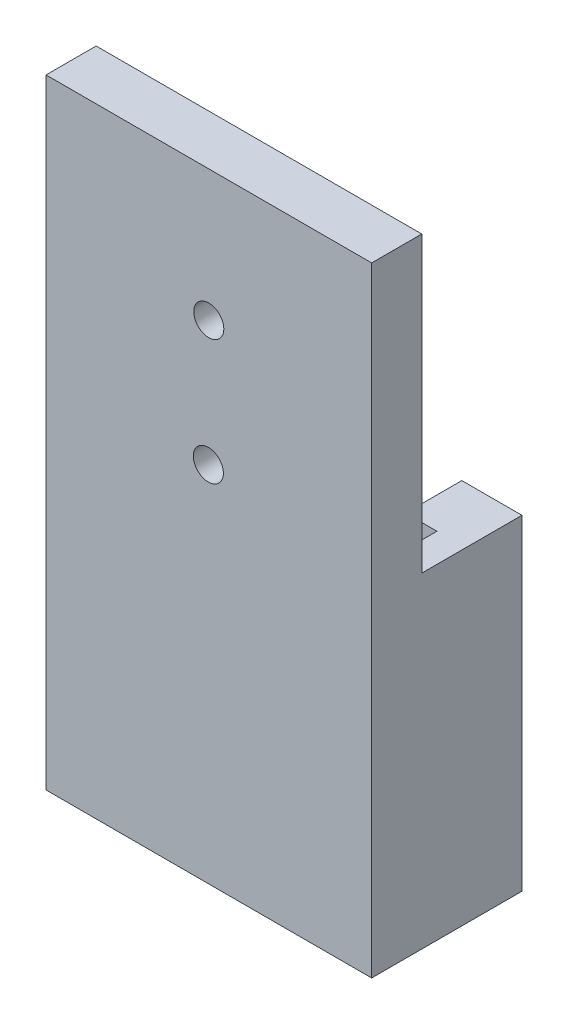
ISO-10303-21;
HEADER;
FILE_DESCRIPTION(('STEP AP214'),'2;1');
FILE_NAME('part.step','',(''),(''),'','','');
FILE_SCHEMA(('AUTOMOTIVE_DESIGN { 1 0 10303 214 1 1 1 1 }'));
ENDSEC;
DATA;
#1=APPLICATION_CONTEXT('core data for automotive mechanical design processes');
#2=APPLICATION_PROTOCOL_DEFINITION('international standard','automotive_design',2000,#1);
#3=PRODUCT_CONTEXT('',#1,'mechanical');
#4=PRODUCT('Part','Part','',(#3));
#5=PRODUCT_RELATED_PRODUCT_CATEGORY('part','',(#4));
#6=PRODUCT_DEFINITION_FORMATION('','',#4);
#7=PRODUCT_DEFINITION_CONTEXT('part definition',#1,'design');
#8=PRODUCT_DEFINITION('design','',#6,#7);
#9=PRODUCT_DEFINITION_SHAPE('','',#8);
#10=(LENGTH_UNIT() NAMED_UNIT(*) SI_UNIT(.MILLI.,.METRE.));
#11=(NAMED_UNIT(*) PLANE_ANGLE_UNIT() SI_UNIT($,.RADIAN.));
#12=(NAMED_UNIT(*) SI_UNIT($,.STERADIAN.) SOLID_ANGLE_UNIT());
#13=UNCERTAINTY_MEASURE_WITH_UNIT(LENGTH_MEASURE(1.E-05),#10,'distance_accuracy_value','');
#14=(GEOMETRIC_REPRESENTATION_CONTEXT(3) GLOBAL_UNCERTAINTY_ASSIGNED_CONTEXT((#13)) GLOBAL_UNIT_ASSIGNED_CONTEXT((#10,
#11,#12)) REPRESENTATION_CONTEXT('',''));
#15=CARTESIAN_POINT('',(0.,0.,0.));
#16=DIRECTION('',(0.,0.,1.));
#17=DIRECTION('',(1.,0.,0.));
#18=AXIS2_PLACEMENT_3D('',#15,#16,#17);
#19=CARTESIAN_POINT('',(0.,16.,0.));
#20=DIRECTION('',(0.,1.,0.));
#21=DIRECTION('',(-1.,0.,0.));
#22=AXIS2_PLACEMENT_3D('',#19,#20,#21);
#23=PLANE('',#22);
#24=DIRECTION('',(0.,0.,-1.));
#25=VECTOR('',#24,1.);
#26=CARTESIAN_POINT('',(-5.14366425361586,16.,4.));
#27=LINE('',#26,#25);
#28=CARTESIAN_POINT('',(-5.14366425361586,16.,0.));
#29=VERTEX_POINT('',#28);
#30=CARTESIAN_POINT('',(-5.14366425361586,16.,-8.));
#31=VERTEX_POINT('',#30);
#32=EDGE_CURVE('E180',#29,#31,#27,.T.);
#33=ORIENTED_EDGE('',*,*,#32,.F.);
#34=DIRECTION('',(1.,0.,0.));
#35=VECTOR('',#34,1.);
#36=CARTESIAN_POINT('',(0.,16.,0.));
#37=LINE('',#36,#35);
#38=CARTESIAN_POINT('',(0.,16.,0.));
#39=VERTEX_POINT('',#38);
#40=EDGE_CURVE('E177',#29,#39,#37,.T.);
#41=ORIENTED_EDGE('',*,*,#40,.T.);
#42=DIRECTION('',(0.00140481763492439,0.,0.999999013243219));
#43=VECTOR('',#42,1.);
#44=CARTESIAN_POINT('',(-0.000702409510571505,16.,-0.500000000000003));
#45=LINE('',#44,#43);
#46=CARTESIAN_POINT('',(-0.000702409510571505,16.,-0.500000000000003));
#47=VERTEX_POINT('',#46);
#48=EDGE_CURVE('E204',#47,#39,#45,.T.);
#49=ORIENTED_EDGE('',*,*,#48,.F.);
#50=DIRECTION('',(1.,0.,0.));
#51=VECTOR('',#50,1.);
#52=CARTESIAN_POINT('',(-2.85496603758894,16.,-0.500000000000003));
#53=LINE('',#52,#51);
#54=CARTESIAN_POINT('',(-2.85496603758894,16.,-0.500000000000003));
#55=VERTEX_POINT('',#54);
#56=EDGE_CURVE('E201',#55,#47,#53,.T.);
#57=ORIENTED_EDGE('',*,*,#56,.F.);
#58=DIRECTION('',(0.,0.,1.));
#59=VECTOR('',#58,1.);
#60=CARTESIAN_POINT('',(-2.85496603758894,16.,-3.5));
#61=LINE('',#60,#59);
#62=CARTESIAN_POINT('',(-2.85496603758894,16.,-3.5));
#63=VERTEX_POINT('',#62);
#64=EDGE_CURVE('E198',#63,#55,#61,.T.);
#65=ORIENTED_EDGE('',*,*,#64,.F.);
#66=DIRECTION('',(-1.,0.,0.));
#67=VECTOR('',#66,1.);
#68=CARTESIAN_POINT('',(-0.343664253615856,16.,-3.5));
#69=LINE('',#68,#67);
#70=CARTESIAN_POINT('',(-0.343664253615856,16.,-3.5));
#71=VERTEX_POINT('',#70);
#72=EDGE_CURVE('E195',#71,#63,#69,.T.);
#73=ORIENTED_EDGE('',*,*,#72,.F.);
#74=DIRECTION('',(0.,0.,1.));
#75=VECTOR('',#74,1.);
#76=CARTESIAN_POINT('',(-0.343664253615856,16.,-3.5));
#77=LINE('',#76,#75);
#78=CARTESIAN_POINT('',(-0.343664253615856,16.,-8.));
#79=VERTEX_POINT('',#78);
#80=EDGE_CURVE('E192',#79,#71,#77,.T.);
#81=ORIENTED_EDGE('',*,*,#80,.F.);
#82=DIRECTION('',(1.,0.,0.));
#83=VECTOR('',#82,1.);
#84=CARTESIAN_POINT('',(-5.14366425361586,16.,-8.));
#85=LINE('',#84,#83);
#86=EDGE_CURVE('E183',#31,#79,#85,.T.);
#87=ORIENTED_EDGE('',*,*,#86,.F.);
#88=EDGE_LOOP('',(#33,#41,#49,#57,#65,#73,#81,#87));
#89=FACE_BOUND('',#88,.T.);
#90=ADVANCED_FACE('F33',(#89),#23,.T.);
#91=DIRECTION('',(0.0014048176349244,0.,-0.999999013243219));
#92=VECTOR('',#91,1.);
#93=CARTESIAN_POINT('',(15.7133739022788,16.,-0.500000000000001));
#94=LINE('',#93,#92);
#95=CARTESIAN_POINT('',(15.7126714927683,16.,0.));
#96=VERTEX_POINT('',#95);
#97=CARTESIAN_POINT('',(15.7133739022788,16.,-0.500000000000001));
#98=VERTEX_POINT('',#97);
#99=EDGE_CURVE('E176',#96,#98,#94,.T.);
#100=ORIENTED_EDGE('',*,*,#99,.F.);
#101=DIRECTION('',(1.,0.,0.));
#102=VECTOR('',#101,1.);
#103=CARTESIAN_POINT('',(14.3444247635274,16.,0.));
#104=LINE('',#103,#102);
#105=CARTESIAN_POINT('',(20.8563357463841,16.,0.));
#106=VERTEX_POINT('',#105);
#107=EDGE_CURVE('E163',#96,#106,#104,.T.);
#108=ORIENTED_EDGE('',*,*,#107,.T.);
#109=DIRECTION('',(0.,0.,1.));
#110=VECTOR('',#109,1.);
#111=CARTESIAN_POINT('',(20.8563357463841,16.,4.00000000000001));
#112=LINE('',#111,#110);
#113=CARTESIAN_POINT('',(20.8563357463841,16.,-8.));
#114=VERTEX_POINT('',#113);
#115=EDGE_CURVE('E172',#114,#106,#112,.T.);
#116=ORIENTED_EDGE('',*,*,#115,.F.);
#117=DIRECTION('',(1.,0.,0.));
#118=VECTOR('',#117,1.);
#119=CARTESIAN_POINT('',(20.8563357463841,16.,-8.));
#120=LINE('',#119,#118);
#121=CARTESIAN_POINT('',(16.0563357463841,16.,-8.));
#122=VERTEX_POINT('',#121);
#123=EDGE_CURVE('E220',#122,#114,#120,.T.);
#124=ORIENTED_EDGE('',*,*,#123,.F.);
#125=DIRECTION('',(0.,0.,-1.));
#126=VECTOR('',#125,1.);
#127=CARTESIAN_POINT('',(16.0563357463841,16.,-3.5));
#128=LINE('',#127,#126);
#129=CARTESIAN_POINT('',(16.0563357463841,16.,-3.5));
#130=VERTEX_POINT('',#129);
#131=EDGE_CURVE('E217',#130,#122,#128,.T.);
#132=ORIENTED_EDGE('',*,*,#131,.F.);
#133=DIRECTION('',(-1.,0.,0.));
#134=VECTOR('',#133,1.);
#135=CARTESIAN_POINT('',(16.0563357463841,16.,-3.5));
#136=LINE('',#135,#134);
#137=CARTESIAN_POINT('',(18.5676375303572,16.,-3.5));
#138=VERTEX_POINT('',#137);
#139=EDGE_CURVE('E214',#138,#130,#136,.T.);
#140=ORIENTED_EDGE('',*,*,#139,.F.);
#141=DIRECTION('',(0.,0.,-1.));
#142=VECTOR('',#141,1.);
#143=CARTESIAN_POINT('',(18.5676375303572,16.,-3.5));
#144=LINE('',#143,#142);
#145=CARTESIAN_POINT('',(18.5676375303572,16.,-0.5));
#146=VERTEX_POINT('',#145);
#147=EDGE_CURVE('E211',#146,#138,#144,.T.);
#148=ORIENTED_EDGE('',*,*,#147,.F.);
#149=DIRECTION('',(1.,0.,0.));
#150=VECTOR('',#149,1.);
#151=CARTESIAN_POINT('',(18.5676375303572,16.,-0.5));
#152=LINE('',#151,#150);
#153=EDGE_CURVE('E208',#98,#146,#152,.T.);
#154=ORIENTED_EDGE('',*,*,#153,.F.);
#155=EDGE_LOOP('',(#100,#108,#116,#124,#132,#140,#148,#154));
#156=FACE_BOUND('',#155,.T.);
#157=ADVANCED_FACE('F170',(#156),#23,.T.);
#158=CARTESIAN_POINT('',(0.,0.,4.));
#159=DIRECTION('',(0.,0.,-1.));
#160=DIRECTION('',(-1.,0.,0.));
#161=AXIS2_PLACEMENT_3D('',#158,#159,#160);
#162=PLANE('',#161);
#163=DIRECTION('',(-1.,0.,0.));
#164=VECTOR('',#163,1.);
#165=CARTESIAN_POINT('',(20.8563357463841,39.4529851669287,4.));
#166=LINE('',#165,#164);
#167=CARTESIAN_POINT('',(20.8563357463841,39.4529851669287,4.));
#168=VERTEX_POINT('',#167);
#169=CARTESIAN_POINT('',(-5.14366425361586,39.4529851669287,4.));
#170=VERTEX_POINT('',#169);
#171=EDGE_CURVE('E470',#168,#170,#166,.T.);
#172=ORIENTED_EDGE('',*,*,#171,.T.);
#173=DIRECTION('',(0.,-1.,0.));
#174=VECTOR('',#173,1.);
#175=CARTESIAN_POINT('',(-5.14366425361586,16.,4.));
#176=LINE('',#175,#174);
#177=CARTESIAN_POINT('',(-5.14366425361586,-10.,4.));
#178=VERTEX_POINT('',#177);
#179=EDGE_CURVE('E249',#170,#178,#176,.T.);
#180=ORIENTED_EDGE('',*,*,#179,.T.);
#181=DIRECTION('',(-1.,0.,0.));
#182=VECTOR('',#181,1.);
#183=CARTESIAN_POINT('',(-5.14366425361586,-10.,4.));
#184=LINE('',#183,#182);
#185=CARTESIAN_POINT('',(20.8563357463841,-10.,4.00000000000001));
#186=VERTEX_POINT('',#185);
#187=EDGE_CURVE('E491',#186,#178,#184,.T.);
#188=ORIENTED_EDGE('',*,*,#187,.F.);
#189=DIRECTION('',(0.,-1.,0.));
#190=VECTOR('',#189,1.);
#191=CARTESIAN_POINT('',(20.8563357463841,16.,4.00000000000001));
#192=LINE('',#191,#190);
#193=EDGE_CURVE('E222',#168,#186,#192,.T.);
#194=ORIENTED_EDGE('',*,*,#193,.F.);
#195=EDGE_LOOP('',(#172,#180,#188,#194));
#196=FACE_BOUND('',#195,.T.);
#197=CARTESIAN_POINT('',(7.85000000000005,28.9782079962256,4.));
#198=DIRECTION('',(0.,0.,1.));
#199=DIRECTION('',(1.,0.,0.));
#200=AXIS2_PLACEMENT_3D('',#197,#198,#199);
#201=CIRCLE('',#200,1.2);
#202=CARTESIAN_POINT('',(9.05000000000005,28.9782079962256,4.));
#203=VERTEX_POINT('',#202);
#204=EDGE_CURVE('E41',#203,#203,#201,.T.);
#205=ORIENTED_EDGE('',*,*,#204,.F.);
#206=EDGE_LOOP('',(#205));
#207=FACE_BOUND('',#206,.T.);
#208=CARTESIAN_POINT('',(7.81487952447152,18.9782696688059,4.));
#209=DIRECTION('',(0.,0.,1.));
#210=DIRECTION('',(1.,0.,0.));
#211=AXIS2_PLACEMENT_3D('',#208,#209,#210);
#212=CIRCLE('',#211,1.2);
#213=CARTESIAN_POINT('',(9.01487952447152,18.9782696688059,4.));
#214=VERTEX_POINT('',#213);
#215=EDGE_CURVE('E252',#214,#214,#212,.T.);
#216=ORIENTED_EDGE('',*,*,#215,.F.);
#217=EDGE_LOOP('',(#216));
#218=FACE_BOUND('',#217,.T.);
#219=ADVANCED_FACE('F274',(#196,#207,#218),#162,.F.);
#220=CARTESIAN_POINT('',(0.,0.,0.));
#221=DIRECTION('',(0.,0.,-1.));
#222=DIRECTION('',(-1.,0.,0.));
#223=AXIS2_PLACEMENT_3D('',#220,#221,#222);
#224=PLANE('',#223);
#225=DIRECTION('',(0.,-1.,0.));
#226=VECTOR('',#225,1.);
#227=CARTESIAN_POINT('',(0.,16.,0.));
#228=LINE('',#227,#226);
#229=CARTESIAN_POINT('',(0.,-10.,0.));
#230=VERTEX_POINT('',#229);
#231=EDGE_CURVE('E235',#39,#230,#228,.T.);
#232=ORIENTED_EDGE('',*,*,#231,.F.);
#233=ORIENTED_EDGE('',*,*,#40,.F.);
#234=DIRECTION('',(0.,-1.,0.));
#235=VECTOR('',#234,1.);
#236=CARTESIAN_POINT('',(-5.14366425361586,16.,0.));
#237=LINE('',#236,#235);
#238=CARTESIAN_POINT('',(-5.14366425361586,39.4529851669287,0.));
#239=VERTEX_POINT('',#238);
#240=EDGE_CURVE('E48',#239,#29,#237,.T.);
#241=ORIENTED_EDGE('',*,*,#240,.F.);
#242=DIRECTION('',(-1.,0.,0.));
#243=VECTOR('',#242,1.);
#244=CARTESIAN_POINT('',(20.8563357463841,39.4529851669287,0.));
#245=LINE('',#244,#243);
#246=CARTESIAN_POINT('',(20.8563357463841,39.4529851669287,0.));
#247=VERTEX_POINT('',#246);
#248=EDGE_CURVE('E166',#247,#239,#245,.T.);
#249=ORIENTED_EDGE('',*,*,#248,.F.);
#250=DIRECTION('',(0.,1.,0.));
#251=VECTOR('',#250,1.);
#252=CARTESIAN_POINT('',(20.8563357463841,16.,0.));
#253=LINE('',#252,#251);
#254=EDGE_CURVE('E159',#106,#247,#253,.T.);
#255=ORIENTED_EDGE('',*,*,#254,.F.);
#256=ORIENTED_EDGE('',*,*,#107,.F.);
#257=DIRECTION('',(0.,1.,0.));
#258=VECTOR('',#257,1.);
#259=CARTESIAN_POINT('',(15.7126714927683,0.,0.));
#260=LINE('',#259,#258);
#261=CARTESIAN_POINT('',(15.7126714927683,-10.,0.));
#262=VERTEX_POINT('',#261);
#263=EDGE_CURVE('E11',#262,#96,#260,.T.);
#264=ORIENTED_EDGE('',*,*,#263,.F.);
#265=DIRECTION('',(1.,0.,0.));
#266=VECTOR('',#265,1.);
#267=CARTESIAN_POINT('',(15.7126714927683,-10.,0.));
#268=LINE('',#267,#266);
#269=EDGE_CURVE('E514',#230,#262,#268,.T.);
#270=ORIENTED_EDGE('',*,*,#269,.F.);
#271=EDGE_LOOP('',(#232,#233,#241,#249,#255,#256,#264,#270));
#272=FACE_BOUND('',#271,.T.);
#273=CARTESIAN_POINT('',(7.85000000000005,28.9782079962256,0.));
#274=DIRECTION('',(0.,0.,1.));
#275=DIRECTION('',(1.,0.,0.));
#276=AXIS2_PLACEMENT_3D('',#273,#274,#275);
#277=CIRCLE('',#276,1.2);
#278=CARTESIAN_POINT('',(9.05000000000005,28.9782079962256,0.));
#279=VERTEX_POINT('',#278);
#280=EDGE_CURVE('E255',#279,#279,#277,.T.);
#281=ORIENTED_EDGE('',*,*,#280,.T.);
#282=EDGE_LOOP('',(#281));
#283=FACE_BOUND('',#282,.T.);
#284=CARTESIAN_POINT('',(7.81487952447152,18.9782696688059,0.));
#285=DIRECTION('',(0.,0.,1.));
#286=DIRECTION('',(1.,0.,0.));
#287=AXIS2_PLACEMENT_3D('',#284,#285,#286);
#288=CIRCLE('',#287,1.2);
#289=CARTESIAN_POINT('',(9.01487952447152,18.9782696688059,0.));
#290=VERTEX_POINT('',#289);
#291=EDGE_CURVE('E224',#290,#290,#288,.T.);
#292=ORIENTED_EDGE('',*,*,#291,.T.);
#293=EDGE_LOOP('',(#292));
#294=FACE_BOUND('',#293,.T.);
#295=ADVANCED_FACE('F35',(#272,#283,#294),#224,.T.);
#296=CARTESIAN_POINT('',(7.85000000000005,28.9782079962256,4.));
#297=DIRECTION('',(0.,0.,-1.));
#298=DIRECTION('',(-1.,0.,0.));
#299=AXIS2_PLACEMENT_3D('',#296,#297,#298);
#300=CYLINDRICAL_SURFACE('',#299,1.2);
#301=ORIENTED_EDGE('',*,*,#204,.T.);
#302=EDGE_LOOP('',(#301));
#303=FACE_BOUND('',#302,.T.);
#304=ORIENTED_EDGE('',*,*,#280,.F.);
#305=EDGE_LOOP('',(#304));
#306=FACE_BOUND('',#305,.T.);
#307=ADVANCED_FACE('F263',(#303,#306),#300,.F.);
#308=CARTESIAN_POINT('',(7.81487952447152,18.9782696688059,4.));
#309=DIRECTION('',(0.,0.,-1.));
#310=DIRECTION('',(-1.,0.,0.));
#311=AXIS2_PLACEMENT_3D('',#308,#309,#310);
#312=CYLINDRICAL_SURFACE('',#311,1.2);
#313=ORIENTED_EDGE('',*,*,#215,.T.);
#314=EDGE_LOOP('',(#313));
#315=FACE_BOUND('',#314,.T.);
#316=ORIENTED_EDGE('',*,*,#291,.F.);
#317=EDGE_LOOP('',(#316));
#318=FACE_BOUND('',#317,.T.);
#319=ADVANCED_FACE('F265',(#315,#318),#312,.F.);
#320=CARTESIAN_POINT('',(20.8563357463841,16.,4.00000000000001));
#321=DIRECTION('',(1.,0.,0.));
#322=DIRECTION('',(0.,1.,0.));
#323=AXIS2_PLACEMENT_3D('',#320,#321,#322);
#324=PLANE('',#323);
#325=ORIENTED_EDGE('',*,*,#193,.T.);
#326=DIRECTION('',(0.,0.,1.));
#327=VECTOR('',#326,1.);
#328=CARTESIAN_POINT('',(20.8563357463841,-10.,4.00000000000001));
#329=LINE('',#328,#327);
#330=CARTESIAN_POINT('',(20.8563357463841,-10.,-8.));
#331=VERTEX_POINT('',#330);
#332=EDGE_CURVE('E486',#331,#186,#329,.T.);
#333=ORIENTED_EDGE('',*,*,#332,.F.);
#334=DIRECTION('',(0.,-1.,0.));
#335=VECTOR('',#334,1.);
#336=CARTESIAN_POINT('',(20.8563357463841,16.,-8.));
#337=LINE('',#336,#335);
#338=EDGE_CURVE('E56',#114,#331,#337,.T.);
#339=ORIENTED_EDGE('',*,*,#338,.F.);
#340=ORIENTED_EDGE('',*,*,#115,.T.);
#341=ORIENTED_EDGE('',*,*,#254,.T.);
#342=DIRECTION('',(0.,0.,1.));
#343=VECTOR('',#342,1.);
#344=CARTESIAN_POINT('',(20.8563357463841,39.4529851669287,0.));
#345=LINE('',#344,#343);
#346=EDGE_CURVE('E487',#247,#168,#345,.T.);
#347=ORIENTED_EDGE('',*,*,#346,.T.);
#348=EDGE_LOOP('',(#325,#333,#339,#340,#341,#347));
#349=FACE_BOUND('',#348,.T.);
#350=ADVANCED_FACE('F179',(#349),#324,.T.);
#351=CARTESIAN_POINT('',(20.8563357463841,16.,-8.));
#352=DIRECTION('',(0.,0.,-1.));
#353=DIRECTION('',(-1.,0.,0.));
#354=AXIS2_PLACEMENT_3D('',#351,#352,#353);
#355=PLANE('',#354);
#356=ORIENTED_EDGE('',*,*,#338,.T.);
#357=DIRECTION('',(1.,0.,0.));
#358=VECTOR('',#357,1.);
#359=CARTESIAN_POINT('',(20.8563357463841,-10.,-8.));
#360=LINE('',#359,#358);
#361=CARTESIAN_POINT('',(16.0563357463841,-10.,-8.));
#362=VERTEX_POINT('',#361);
#363=EDGE_CURVE('E181',#362,#331,#360,.T.);
#364=ORIENTED_EDGE('',*,*,#363,.F.);
#365=DIRECTION('',(0.,-1.,0.));
#366=VECTOR('',#365,1.);
#367=CARTESIAN_POINT('',(16.0563357463841,16.,-8.));
#368=LINE('',#367,#366);
#369=EDGE_CURVE('E225',#122,#362,#368,.T.);
#370=ORIENTED_EDGE('',*,*,#369,.F.);
#371=ORIENTED_EDGE('',*,*,#123,.T.);
#372=EDGE_LOOP('',(#356,#364,#370,#371));
#373=FACE_BOUND('',#372,.T.);
#374=ADVANCED_FACE('F286',(#373),#355,.T.);
#375=CARTESIAN_POINT('',(16.0563357463841,16.,-3.5));
#376=DIRECTION('',(-1.,0.,0.));
#377=DIRECTION('',(0.,-1.,0.));
#378=AXIS2_PLACEMENT_3D('',#375,#376,#377);
#379=PLANE('',#378);
#380=ORIENTED_EDGE('',*,*,#369,.T.);
#381=DIRECTION('',(0.,0.,-1.));
#382=VECTOR('',#381,1.);
#383=CARTESIAN_POINT('',(16.0563357463841,-10.,-3.5));
#384=LINE('',#383,#382);
#385=CARTESIAN_POINT('',(16.0563357463841,-10.,-3.5));
#386=VERTEX_POINT('',#385);
#387=EDGE_CURVE('E186',#386,#362,#384,.T.);
#388=ORIENTED_EDGE('',*,*,#387,.F.);
#389=DIRECTION('',(0.,-1.,0.));
#390=VECTOR('',#389,1.);
#391=CARTESIAN_POINT('',(16.0563357463841,16.,-3.5));
#392=LINE('',#391,#390);
#393=EDGE_CURVE('E227',#130,#386,#392,.T.);
#394=ORIENTED_EDGE('',*,*,#393,.F.);
#395=ORIENTED_EDGE('',*,*,#131,.T.);
#396=EDGE_LOOP('',(#380,#388,#394,#395));
#397=FACE_BOUND('',#396,.T.);
#398=ADVANCED_FACE('F289',(#397),#379,.T.);
#399=CARTESIAN_POINT('',(16.0563357463841,16.,-3.5));
#400=DIRECTION('',(0.,0.,1.));
#401=DIRECTION('',(1.,0.,0.));
#402=AXIS2_PLACEMENT_3D('',#399,#400,#401);
#403=PLANE('',#402);
#404=ORIENTED_EDGE('',*,*,#393,.T.);
#405=DIRECTION('',(-1.,0.,0.));
#406=VECTOR('',#405,1.);
#407=CARTESIAN_POINT('',(16.0563357463841,-10.,-3.5));
#408=LINE('',#407,#406);
#409=CARTESIAN_POINT('',(18.5676375303572,-10.,-3.5));
#410=VERTEX_POINT('',#409);
#411=EDGE_CURVE('E526',#410,#386,#408,.T.);
#412=ORIENTED_EDGE('',*,*,#411,.F.);
#413=DIRECTION('',(0.,-1.,0.));
#414=VECTOR('',#413,1.);
#415=CARTESIAN_POINT('',(18.5676375303572,16.,-3.5));
#416=LINE('',#415,#414);
#417=EDGE_CURVE('E229',#138,#410,#416,.T.);
#418=ORIENTED_EDGE('',*,*,#417,.F.);
#419=ORIENTED_EDGE('',*,*,#139,.T.);
#420=EDGE_LOOP('',(#404,#412,#418,#419));
#421=FACE_BOUND('',#420,.T.);
#422=ADVANCED_FACE('F293',(#421),#403,.T.);
#423=CARTESIAN_POINT('',(18.5676375303572,16.,-3.5));
#424=DIRECTION('',(-1.,0.,0.));
#425=DIRECTION('',(0.,-1.,0.));
#426=AXIS2_PLACEMENT_3D('',#423,#424,#425);
#427=PLANE('',#426);
#428=ORIENTED_EDGE('',*,*,#417,.T.);
#429=DIRECTION('',(0.,0.,-1.));
#430=VECTOR('',#429,1.);
#431=CARTESIAN_POINT('',(18.5676375303572,-10.,-3.5));
#432=LINE('',#431,#430);
#433=CARTESIAN_POINT('',(18.5676375303572,-10.,-0.5));
#434=VERTEX_POINT('',#433);
#435=EDGE_CURVE('E523',#434,#410,#432,.T.);
#436=ORIENTED_EDGE('',*,*,#435,.F.);
#437=DIRECTION('',(0.,-1.,0.));
#438=VECTOR('',#437,1.);
#439=CARTESIAN_POINT('',(18.5676375303572,16.,-0.5));
#440=LINE('',#439,#438);
#441=EDGE_CURVE('E231',#146,#434,#440,.T.);
#442=ORIENTED_EDGE('',*,*,#441,.F.);
#443=ORIENTED_EDGE('',*,*,#147,.T.);
#444=EDGE_LOOP('',(#428,#436,#442,#443));
#445=FACE_BOUND('',#444,.T.);
#446=ADVANCED_FACE('F297',(#445),#427,.T.);
#447=CARTESIAN_POINT('',(18.5676375303572,16.,-0.5));
#448=DIRECTION('',(0.,0.,-1.));
#449=DIRECTION('',(-1.,0.,0.));
#450=AXIS2_PLACEMENT_3D('',#447,#448,#449);
#451=PLANE('',#450);
#452=ORIENTED_EDGE('',*,*,#441,.T.);
#453=DIRECTION('',(1.,0.,0.));
#454=VECTOR('',#453,1.);
#455=CARTESIAN_POINT('',(18.5676375303572,-10.,-0.5));
#456=LINE('',#455,#454);
#457=CARTESIAN_POINT('',(15.7133739022789,-10.,-0.500000000000001));
#458=VERTEX_POINT('',#457);
#459=EDGE_CURVE('E520',#458,#434,#456,.T.);
#460=ORIENTED_EDGE('',*,*,#459,.F.);
#461=DIRECTION('',(0.,-1.,0.));
#462=VECTOR('',#461,1.);
#463=CARTESIAN_POINT('',(15.7133739022788,16.,-0.500000000000001));
#464=LINE('',#463,#462);
#465=EDGE_CURVE('E233',#98,#458,#464,.T.);
#466=ORIENTED_EDGE('',*,*,#465,.F.);
#467=ORIENTED_EDGE('',*,*,#153,.T.);
#468=EDGE_LOOP('',(#452,#460,#466,#467));
#469=FACE_BOUND('',#468,.T.);
#470=ADVANCED_FACE('F301',(#469),#451,.T.);
#471=CARTESIAN_POINT('',(15.7133739022788,16.,-0.500000000000001));
#472=DIRECTION('',(-0.99999901324322,0.,-0.0014048176349244));
#473=DIRECTION('',(-0.0014048176349244,0.,0.99999901324322));
#474=AXIS2_PLACEMENT_3D('',#471,#472,#473);
#475=PLANE('',#474);
#476=ORIENTED_EDGE('',*,*,#465,.T.);
#477=DIRECTION('',(0.0014048176349244,0.,-0.999999013243219));
#478=VECTOR('',#477,1.);
#479=CARTESIAN_POINT('',(15.7133739022789,-10.,-0.500000000000001));
#480=LINE('',#479,#478);
#481=EDGE_CURVE('E517',#262,#458,#480,.T.);
#482=ORIENTED_EDGE('',*,*,#481,.F.);
#483=ORIENTED_EDGE('',*,*,#263,.T.);
#484=ORIENTED_EDGE('',*,*,#99,.T.);
#485=EDGE_LOOP('',(#476,#482,#483,#484));
#486=FACE_BOUND('',#485,.T.);
#487=ADVANCED_FACE('F305',(#486),#475,.T.);
#488=CARTESIAN_POINT('',(-0.000702409510571505,16.,-0.500000000000003));
#489=DIRECTION('',(0.99999901324322,0.,-0.00140481763492439));
#490=DIRECTION('',(-0.00140481763492439,0.,-0.99999901324322));
#491=AXIS2_PLACEMENT_3D('',#488,#489,#490);
#492=PLANE('',#491);
#493=ORIENTED_EDGE('',*,*,#231,.T.);
#494=DIRECTION('',(0.00140481763492439,0.,0.999999013243219));
#495=VECTOR('',#494,1.);
#496=CARTESIAN_POINT('',(-0.000702409510568321,-10.,-0.500000000000003));
#497=LINE('',#496,#495);
#498=CARTESIAN_POINT('',(-0.000702409510568321,-10.,-0.500000000000003));
#499=VERTEX_POINT('',#498);
#500=EDGE_CURVE('E511',#499,#230,#497,.T.);
#501=ORIENTED_EDGE('',*,*,#500,.F.);
#502=DIRECTION('',(0.,-1.,0.));
#503=VECTOR('',#502,1.);
#504=CARTESIAN_POINT('',(-0.000702409510571505,16.,-0.500000000000003));
#505=LINE('',#504,#503);
#506=EDGE_CURVE('E237',#47,#499,#505,.T.);
#507=ORIENTED_EDGE('',*,*,#506,.F.);
#508=ORIENTED_EDGE('',*,*,#48,.T.);
#509=EDGE_LOOP('',(#493,#501,#507,#508));
#510=FACE_BOUND('',#509,.T.);
#511=ADVANCED_FACE('F309',(#510),#492,.T.);
#512=CARTESIAN_POINT('',(-2.85496603758894,16.,-0.500000000000003));
#513=DIRECTION('',(0.,0.,-1.));
#514=DIRECTION('',(-1.,0.,0.));
#515=AXIS2_PLACEMENT_3D('',#512,#513,#514);
#516=PLANE('',#515);
#517=ORIENTED_EDGE('',*,*,#506,.T.);
#518=DIRECTION('',(1.,0.,0.));
#519=VECTOR('',#518,1.);
#520=CARTESIAN_POINT('',(-2.85496603758894,-10.,-0.500000000000003));
#521=LINE('',#520,#519);
#522=CARTESIAN_POINT('',(-2.85496603758894,-10.,-0.500000000000003));
#523=VERTEX_POINT('',#522);
#524=EDGE_CURVE('E508',#523,#499,#521,.T.);
#525=ORIENTED_EDGE('',*,*,#524,.F.);
#526=DIRECTION('',(0.,-1.,0.));
#527=VECTOR('',#526,1.);
#528=CARTESIAN_POINT('',(-2.85496603758894,16.,-0.500000000000003));
#529=LINE('',#528,#527);
#530=EDGE_CURVE('E239',#55,#523,#529,.T.);
#531=ORIENTED_EDGE('',*,*,#530,.F.);
#532=ORIENTED_EDGE('',*,*,#56,.T.);
#533=EDGE_LOOP('',(#517,#525,#531,#532));
#534=FACE_BOUND('',#533,.T.);
#535=ADVANCED_FACE('F313',(#534),#516,.T.);
#536=CARTESIAN_POINT('',(-2.85496603758894,16.,-3.5));
#537=DIRECTION('',(1.,0.,0.));
#538=DIRECTION('',(0.,0.,-1.));
#539=AXIS2_PLACEMENT_3D('',#536,#537,#538);
#540=PLANE('',#539);
#541=ORIENTED_EDGE('',*,*,#530,.T.);
#542=DIRECTION('',(0.,0.,1.));
#543=VECTOR('',#542,1.);
#544=CARTESIAN_POINT('',(-2.85496603758894,-10.,-3.5));
#545=LINE('',#544,#543);
#546=CARTESIAN_POINT('',(-2.85496603758894,-10.,-3.5));
#547=VERTEX_POINT('',#546);
#548=EDGE_CURVE('E505',#547,#523,#545,.T.);
#549=ORIENTED_EDGE('',*,*,#548,.F.);
#550=DIRECTION('',(0.,-1.,0.));
#551=VECTOR('',#550,1.);
#552=CARTESIAN_POINT('',(-2.85496603758894,16.,-3.5));
#553=LINE('',#552,#551);
#554=EDGE_CURVE('E241',#63,#547,#553,.T.);
#555=ORIENTED_EDGE('',*,*,#554,.F.);
#556=ORIENTED_EDGE('',*,*,#64,.T.);
#557=EDGE_LOOP('',(#541,#549,#555,#556));
#558=FACE_BOUND('',#557,.T.);
#559=ADVANCED_FACE('F317',(#558),#540,.T.);
#560=CARTESIAN_POINT('',(-0.343664253615856,16.,-3.5));
#561=DIRECTION('',(0.,0.,1.));
#562=DIRECTION('',(1.,0.,0.));
#563=AXIS2_PLACEMENT_3D('',#560,#561,#562);
#564=PLANE('',#563);
#565=ORIENTED_EDGE('',*,*,#554,.T.);
#566=DIRECTION('',(-1.,0.,0.));
#567=VECTOR('',#566,1.);
#568=CARTESIAN_POINT('',(-0.343664253615853,-10.,-3.5));
#569=LINE('',#568,#567);
#570=CARTESIAN_POINT('',(-0.343664253615853,-10.,-3.5));
#571=VERTEX_POINT('',#570);
#572=EDGE_CURVE('E502',#571,#547,#569,.T.);
#573=ORIENTED_EDGE('',*,*,#572,.F.);
#574=DIRECTION('',(0.,-1.,0.));
#575=VECTOR('',#574,1.);
#576=CARTESIAN_POINT('',(-0.343664253615856,16.,-3.5));
#577=LINE('',#576,#575);
#578=EDGE_CURVE('E243',#71,#571,#577,.T.);
#579=ORIENTED_EDGE('',*,*,#578,.F.);
#580=ORIENTED_EDGE('',*,*,#72,.T.);
#581=EDGE_LOOP('',(#565,#573,#579,#580));
#582=FACE_BOUND('',#581,.T.);
#583=ADVANCED_FACE('F321',(#582),#564,.T.);
#584=CARTESIAN_POINT('',(-0.343664253615856,16.,-3.5));
#585=DIRECTION('',(1.,0.,0.));
#586=DIRECTION('',(0.,1.,0.));
#587=AXIS2_PLACEMENT_3D('',#584,#585,#586);
#588=PLANE('',#587);
#589=ORIENTED_EDGE('',*,*,#578,.T.);
#590=DIRECTION('',(0.,0.,1.));
#591=VECTOR('',#590,1.);
#592=CARTESIAN_POINT('',(-0.343664253615853,-10.,-3.5));
#593=LINE('',#592,#591);
#594=CARTESIAN_POINT('',(-0.343664253615853,-10.,-8.));
#595=VERTEX_POINT('',#594);
#596=EDGE_CURVE('E499',#595,#571,#593,.T.);
#597=ORIENTED_EDGE('',*,*,#596,.F.);
#598=DIRECTION('',(0.,-1.,0.));
#599=VECTOR('',#598,1.);
#600=CARTESIAN_POINT('',(-0.343664253615856,16.,-8.));
#601=LINE('',#600,#599);
#602=EDGE_CURVE('E245',#79,#595,#601,.T.);
#603=ORIENTED_EDGE('',*,*,#602,.F.);
#604=ORIENTED_EDGE('',*,*,#80,.T.);
#605=EDGE_LOOP('',(#589,#597,#603,#604));
#606=FACE_BOUND('',#605,.T.);
#607=ADVANCED_FACE('F325',(#606),#588,.T.);
#608=CARTESIAN_POINT('',(-5.14366425361586,16.,-8.));
#609=DIRECTION('',(0.,0.,-1.));
#610=DIRECTION('',(-1.,0.,0.));
#611=AXIS2_PLACEMENT_3D('',#608,#609,#610);
#612=PLANE('',#611);
#613=ORIENTED_EDGE('',*,*,#602,.T.);
#614=DIRECTION('',(1.,0.,0.));
#615=VECTOR('',#614,1.);
#616=CARTESIAN_POINT('',(-5.14366425361585,-10.,-8.));
#617=LINE('',#616,#615);
#618=CARTESIAN_POINT('',(-5.14366425361585,-10.,-8.));
#619=VERTEX_POINT('',#618);
#620=EDGE_CURVE('E496',#619,#595,#617,.T.);
#621=ORIENTED_EDGE('',*,*,#620,.F.);
#622=DIRECTION('',(0.,-1.,0.));
#623=VECTOR('',#622,1.);
#624=CARTESIAN_POINT('',(-5.14366425361586,16.,-8.));
#625=LINE('',#624,#623);
#626=EDGE_CURVE('E247',#31,#619,#625,.T.);
#627=ORIENTED_EDGE('',*,*,#626,.F.);
#628=ORIENTED_EDGE('',*,*,#86,.T.);
#629=EDGE_LOOP('',(#613,#621,#627,#628));
#630=FACE_BOUND('',#629,.T.);
#631=ADVANCED_FACE('F329',(#630),#612,.T.);
#632=CARTESIAN_POINT('',(-5.14366425361586,16.,4.));
#633=DIRECTION('',(-1.,0.,0.));
#634=DIRECTION('',(0.,0.,1.));
#635=AXIS2_PLACEMENT_3D('',#632,#633,#634);
#636=PLANE('',#635);
#637=ORIENTED_EDGE('',*,*,#626,.T.);
#638=DIRECTION('',(0.,0.,-1.));
#639=VECTOR('',#638,1.);
#640=CARTESIAN_POINT('',(-5.14366425361586,-10.,4.));
#641=LINE('',#640,#639);
#642=EDGE_CURVE('E493',#178,#619,#641,.T.);
#643=ORIENTED_EDGE('',*,*,#642,.F.);
#644=ORIENTED_EDGE('',*,*,#179,.F.);
#645=DIRECTION('',(0.,0.,1.));
#646=VECTOR('',#645,1.);
#647=CARTESIAN_POINT('',(-5.14366425361586,39.4529851669287,0.));
#648=LINE('',#647,#646);
#649=EDGE_CURVE('E484',#239,#170,#648,.T.);
#650=ORIENTED_EDGE('',*,*,#649,.F.);
#651=ORIENTED_EDGE('',*,*,#240,.T.);
#652=ORIENTED_EDGE('',*,*,#32,.T.);
#653=EDGE_LOOP('',(#637,#643,#644,#650,#651,#652));
#654=FACE_BOUND('',#653,.T.);
#655=ADVANCED_FACE('F333',(#654),#636,.T.);
#656=CARTESIAN_POINT('',(0.,-10.,0.));
#657=DIRECTION('',(0.,1.,0.));
#658=DIRECTION('',(-1.,0.,0.));
#659=AXIS2_PLACEMENT_3D('',#656,#657,#658);
#660=PLANE('',#659);
#661=ORIENTED_EDGE('',*,*,#332,.T.);
#662=ORIENTED_EDGE('',*,*,#187,.T.);
#663=ORIENTED_EDGE('',*,*,#642,.T.);
#664=ORIENTED_EDGE('',*,*,#620,.T.);
#665=ORIENTED_EDGE('',*,*,#596,.T.);
#666=ORIENTED_EDGE('',*,*,#572,.T.);
#667=ORIENTED_EDGE('',*,*,#548,.T.);
#668=ORIENTED_EDGE('',*,*,#524,.T.);
#669=ORIENTED_EDGE('',*,*,#500,.T.);
#670=ORIENTED_EDGE('',*,*,#269,.T.);
#671=ORIENTED_EDGE('',*,*,#481,.T.);
#672=ORIENTED_EDGE('',*,*,#459,.T.);
#673=ORIENTED_EDGE('',*,*,#435,.T.);
#674=ORIENTED_EDGE('',*,*,#411,.T.);
#675=ORIENTED_EDGE('',*,*,#387,.T.);
#676=ORIENTED_EDGE('',*,*,#363,.T.);
#677=EDGE_LOOP('',(#661,#662,#663,#664,#665,#666,#667,#668,#669,#670,#671,#672,#673,#674,#675,#676));
#678=FACE_BOUND('',#677,.T.);
#679=ADVANCED_FACE('F284',(#678),#660,.F.);
#680=CARTESIAN_POINT('',(20.8563357463841,39.4529851669287,0.));
#681=DIRECTION('',(0.,1.,0.));
#682=DIRECTION('',(0.,0.,1.));
#683=AXIS2_PLACEMENT_3D('',#680,#681,#682);
#684=PLANE('',#683);
#685=ORIENTED_EDGE('',*,*,#171,.F.);
#686=ORIENTED_EDGE('',*,*,#346,.F.);
#687=ORIENTED_EDGE('',*,*,#248,.T.);
#688=ORIENTED_EDGE('',*,*,#649,.T.);
#689=EDGE_LOOP('',(#685,#686,#687,#688));
#690=FACE_BOUND('',#689,.T.);
#691=ADVANCED_FACE('F402',(#690),#684,.T.);
#692=CLOSED_SHELL('',(#90,#157,#219,#295,#307,#319,#350,#374,#398,#422,#446,#470,#487,#511,#535,
#559,#583,#607,#631,#655,#679,#691));
#693=MANIFOLD_SOLID_BREP('B2',#692);
#694=ADVANCED_BREP_SHAPE_REPRESENTATION('',(#18,#693),#14);
#695=SHAPE_DEFINITION_REPRESENTATION(#9,#694);
ENDSEC;
END-ISO-10303-21;
